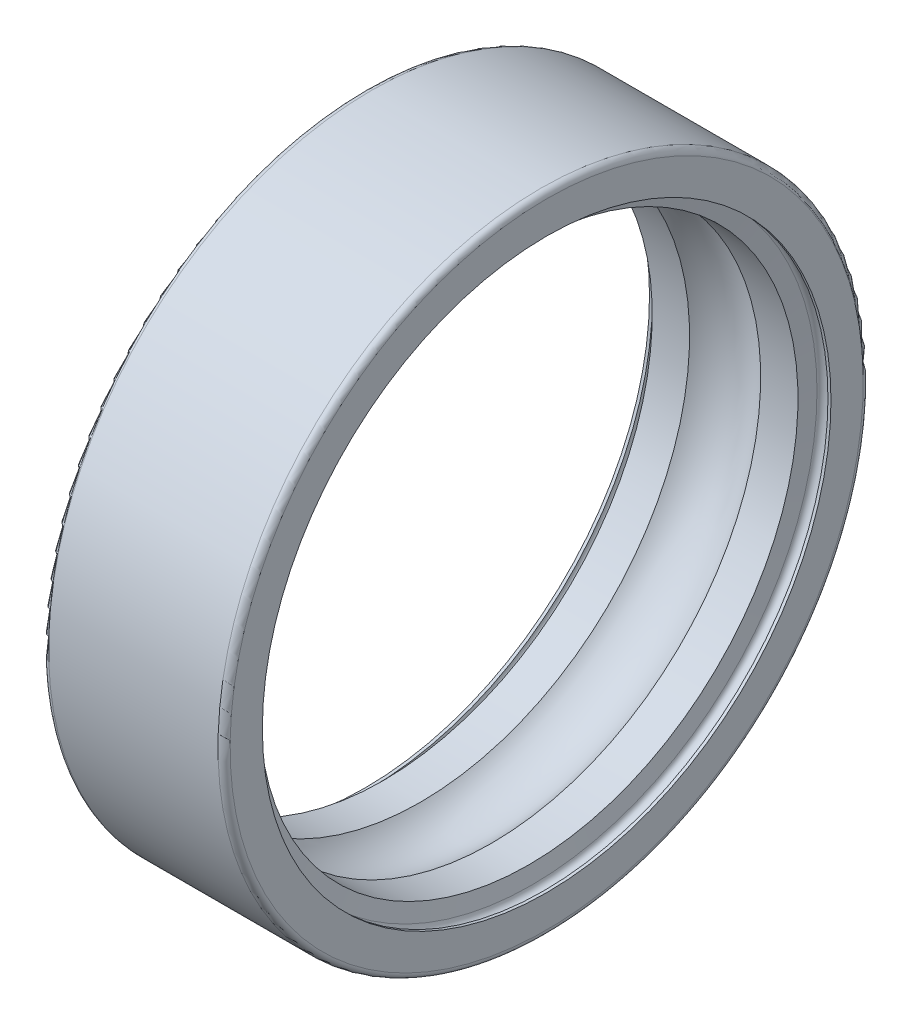
ISO-10303-21;
HEADER;
FILE_DESCRIPTION(('STEP AP214'),'2;1');
FILE_NAME('part.step','',(''),(''),'','','');
FILE_SCHEMA(('AUTOMOTIVE_DESIGN { 1 0 10303 214 1 1 1 1 }'));
ENDSEC;
DATA;
#1=APPLICATION_CONTEXT('core data for automotive mechanical design processes');
#2=APPLICATION_PROTOCOL_DEFINITION('international standard','automotive_design',2000,#1);
#3=PRODUCT_CONTEXT('',#1,'mechanical');
#4=PRODUCT('Part','Part','',(#3));
#5=PRODUCT_RELATED_PRODUCT_CATEGORY('part','',(#4));
#6=PRODUCT_DEFINITION_FORMATION('','',#4);
#7=PRODUCT_DEFINITION_CONTEXT('part definition',#1,'design');
#8=PRODUCT_DEFINITION('design','',#6,#7);
#9=PRODUCT_DEFINITION_SHAPE('','',#8);
#10=(LENGTH_UNIT() NAMED_UNIT(*) SI_UNIT(.MILLI.,.METRE.));
#11=(NAMED_UNIT(*) PLANE_ANGLE_UNIT() SI_UNIT($,.RADIAN.));
#12=(NAMED_UNIT(*) SI_UNIT($,.STERADIAN.) SOLID_ANGLE_UNIT());
#13=UNCERTAINTY_MEASURE_WITH_UNIT(LENGTH_MEASURE(1.E-05),#10,'distance_accuracy_value','');
#14=(GEOMETRIC_REPRESENTATION_CONTEXT(3) GLOBAL_UNCERTAINTY_ASSIGNED_CONTEXT((#13)) GLOBAL_UNIT_ASSIGNED_CONTEXT((#10,
#11,#12)) REPRESENTATION_CONTEXT('',''));
#15=CARTESIAN_POINT('',(0.,0.,0.));
#16=DIRECTION('',(0.,0.,1.));
#17=DIRECTION('',(1.,0.,0.));
#18=AXIS2_PLACEMENT_3D('',#15,#16,#17);
#19=CARTESIAN_POINT('',(8.55,0.,0.));
#20=DIRECTION('',(1.,0.,0.));
#21=DIRECTION('',(0.,0.,-1.));
#22=AXIS2_PLACEMENT_3D('',#19,#20,#21);
#23=TOROIDAL_SURFACE('',#22,14.1,0.3);
#24=CARTESIAN_POINT('',(8.85,0.,0.));
#25=DIRECTION('',(1.,0.,0.));
#26=DIRECTION('',(0.,1.,0.));
#27=AXIS2_PLACEMENT_3D('',#24,#25,#26);
#28=CIRCLE('',#27,14.1);
#29=CARTESIAN_POINT('',(8.85,14.1,0.));
#30=VERTEX_POINT('',#29);
#31=EDGE_CURVE('E11',#30,#30,#28,.T.);
#32=ORIENTED_EDGE('',*,*,#31,.T.);
#33=EDGE_LOOP('',(#32));
#34=FACE_BOUND('',#33,.T.);
#35=CARTESIAN_POINT('',(8.25455767409634,0.,0.));
#36=DIRECTION('',(1.,0.,0.));
#37=DIRECTION('',(0.,1.,0.));
#38=AXIS2_PLACEMENT_3D('',#35,#36,#37);
#39=CIRCLE('',#38,14.1520944533001);
#40=CARTESIAN_POINT('',(8.25455767409634,14.1520944533001,0.));
#41=VERTEX_POINT('',#40);
#42=EDGE_CURVE('E78',#41,#41,#39,.T.);
#43=ORIENTED_EDGE('',*,*,#42,.F.);
#44=EDGE_LOOP('',(#43));
#45=FACE_BOUND('',#44,.T.);
#46=ADVANCED_FACE('F17',(#34,#45),#23,.F.);
#47=CARTESIAN_POINT('',(8.925,0.,0.));
#48=DIRECTION('',(-1.,0.,0.));
#49=DIRECTION('',(0.,1.,0.));
#50=AXIS2_PLACEMENT_3D('',#47,#48,#49);
#51=CYLINDRICAL_SURFACE('',#50,14.1);
#52=CARTESIAN_POINT('',(9.,0.,0.));
#53=DIRECTION('',(1.,0.,0.));
#54=DIRECTION('',(0.,1.,0.));
#55=AXIS2_PLACEMENT_3D('',#52,#53,#54);
#56=CIRCLE('',#55,14.1);
#57=CARTESIAN_POINT('',(9.,14.1,0.));
#58=VERTEX_POINT('',#57);
#59=EDGE_CURVE('E27',#58,#58,#56,.T.);
#60=ORIENTED_EDGE('',*,*,#59,.T.);
#61=EDGE_LOOP('',(#60));
#62=FACE_BOUND('',#61,.T.);
#63=ORIENTED_EDGE('',*,*,#31,.F.);
#64=EDGE_LOOP('',(#63));
#65=FACE_BOUND('',#64,.T.);
#66=ADVANCED_FACE('F117',(#62,#65),#51,.F.);
#67=CARTESIAN_POINT('',(9.,14.9,0.));
#68=DIRECTION('',(1.,0.,0.));
#69=DIRECTION('',(0.,1.,0.));
#70=AXIS2_PLACEMENT_3D('',#67,#68,#69);
#71=PLANE('',#70);
#72=CARTESIAN_POINT('',(9.,0.,0.));
#73=DIRECTION('',(1.,0.,0.));
#74=DIRECTION('',(0.,1.,0.));
#75=AXIS2_PLACEMENT_3D('',#72,#73,#74);
#76=CIRCLE('',#75,15.7);
#77=CARTESIAN_POINT('',(9.,15.7,0.));
#78=VERTEX_POINT('',#77);
#79=EDGE_CURVE('E91',#78,#78,#76,.T.);
#80=ORIENTED_EDGE('',*,*,#79,.T.);
#81=EDGE_LOOP('',(#80));
#82=FACE_BOUND('',#81,.T.);
#83=ORIENTED_EDGE('',*,*,#59,.F.);
#84=EDGE_LOOP('',(#83));
#85=FACE_BOUND('',#84,.T.);
#86=ADVANCED_FACE('F122',(#82,#85),#71,.T.);
#87=CARTESIAN_POINT('',(8.7,0.,0.));
#88=DIRECTION('',(1.,0.,0.));
#89=DIRECTION('',(0.,0.,-1.));
#90=AXIS2_PLACEMENT_3D('',#87,#88,#89);
#91=TOROIDAL_SURFACE('',#90,15.7,0.3);
#92=CARTESIAN_POINT('',(8.7,0.,0.));
#93=DIRECTION('',(1.,0.,0.));
#94=DIRECTION('',(0.,1.,0.));
#95=AXIS2_PLACEMENT_3D('',#92,#93,#94);
#96=CIRCLE('',#95,16.);
#97=CARTESIAN_POINT('',(8.7,16.,0.));
#98=VERTEX_POINT('',#97);
#99=EDGE_CURVE('E88',#98,#98,#96,.T.);
#100=ORIENTED_EDGE('',*,*,#99,.T.);
#101=EDGE_LOOP('',(#100));
#102=FACE_BOUND('',#101,.T.);
#103=ORIENTED_EDGE('',*,*,#79,.F.);
#104=EDGE_LOOP('',(#103));
#105=FACE_BOUND('',#104,.T.);
#106=ADVANCED_FACE('F128',(#102,#105),#91,.T.);
#107=CARTESIAN_POINT('',(4.5,0.,0.));
#108=DIRECTION('',(-1.,0.,0.));
#109=DIRECTION('',(0.,1.,0.));
#110=AXIS2_PLACEMENT_3D('',#107,#108,#109);
#111=CYLINDRICAL_SURFACE('',#110,16.);
#112=CARTESIAN_POINT('',(0.3,0.,0.));
#113=DIRECTION('',(1.,0.,0.));
#114=DIRECTION('',(0.,1.,0.));
#115=AXIS2_PLACEMENT_3D('',#112,#113,#114);
#116=CIRCLE('',#115,16.);
#117=CARTESIAN_POINT('',(0.3,16.,0.));
#118=VERTEX_POINT('',#117);
#119=EDGE_CURVE('E87',#118,#118,#116,.T.);
#120=ORIENTED_EDGE('',*,*,#119,.T.);
#121=EDGE_LOOP('',(#120));
#122=FACE_BOUND('',#121,.T.);
#123=ORIENTED_EDGE('',*,*,#99,.F.);
#124=EDGE_LOOP('',(#123));
#125=FACE_BOUND('',#124,.T.);
#126=ADVANCED_FACE('F114',(#122,#125),#111,.T.);
#127=CARTESIAN_POINT('',(0.3,0.,0.));
#128=DIRECTION('',(1.,0.,0.));
#129=DIRECTION('',(0.,0.,-1.));
#130=AXIS2_PLACEMENT_3D('',#127,#128,#129);
#131=TOROIDAL_SURFACE('',#130,15.7,0.3);
#132=CARTESIAN_POINT('',(0.,0.,0.));
#133=DIRECTION('',(1.,0.,0.));
#134=DIRECTION('',(0.,1.,0.));
#135=AXIS2_PLACEMENT_3D('',#132,#133,#134);
#136=CIRCLE('',#135,15.7);
#137=CARTESIAN_POINT('',(0.,15.7,0.));
#138=VERTEX_POINT('',#137);
#139=EDGE_CURVE('E89',#138,#138,#136,.T.);
#140=ORIENTED_EDGE('',*,*,#139,.T.);
#141=EDGE_LOOP('',(#140));
#142=FACE_BOUND('',#141,.T.);
#143=ORIENTED_EDGE('',*,*,#119,.F.);
#144=EDGE_LOOP('',(#143));
#145=FACE_BOUND('',#144,.T.);
#146=ADVANCED_FACE('F101',(#142,#145),#131,.T.);
#147=CARTESIAN_POINT('',(0.,14.9,0.));
#148=DIRECTION('',(-1.,0.,0.));
#149=DIRECTION('',(0.,-1.,0.));
#150=AXIS2_PLACEMENT_3D('',#147,#148,#149);
#151=PLANE('',#150);
#152=CARTESIAN_POINT('',(0.,0.,0.));
#153=DIRECTION('',(1.,0.,0.));
#154=DIRECTION('',(0.,1.,0.));
#155=AXIS2_PLACEMENT_3D('',#152,#153,#154);
#156=CIRCLE('',#155,14.1);
#157=CARTESIAN_POINT('',(0.,14.1,0.));
#158=VERTEX_POINT('',#157);
#159=EDGE_CURVE('E85',#158,#158,#156,.T.);
#160=ORIENTED_EDGE('',*,*,#159,.T.);
#161=EDGE_LOOP('',(#160));
#162=FACE_BOUND('',#161,.T.);
#163=ORIENTED_EDGE('',*,*,#139,.F.);
#164=EDGE_LOOP('',(#163));
#165=FACE_BOUND('',#164,.T.);
#166=ADVANCED_FACE('F19',(#162,#165),#151,.T.);
#167=CARTESIAN_POINT('',(0.075,0.,0.));
#168=DIRECTION('',(-1.,0.,0.));
#169=DIRECTION('',(0.,1.,0.));
#170=AXIS2_PLACEMENT_3D('',#167,#168,#169);
#171=CYLINDRICAL_SURFACE('',#170,14.1);
#172=CARTESIAN_POINT('',(0.15,0.,0.));
#173=DIRECTION('',(1.,0.,0.));
#174=DIRECTION('',(0.,1.,0.));
#175=AXIS2_PLACEMENT_3D('',#172,#173,#174);
#176=CIRCLE('',#175,14.1);
#177=CARTESIAN_POINT('',(0.15,14.1,0.));
#178=VERTEX_POINT('',#177);
#179=EDGE_CURVE('E83',#178,#178,#176,.T.);
#180=ORIENTED_EDGE('',*,*,#179,.T.);
#181=EDGE_LOOP('',(#180));
#182=FACE_BOUND('',#181,.T.);
#183=ORIENTED_EDGE('',*,*,#159,.F.);
#184=EDGE_LOOP('',(#183));
#185=FACE_BOUND('',#184,.T.);
#186=ADVANCED_FACE('F105',(#182,#185),#171,.F.);
#187=CARTESIAN_POINT('',(0.45,0.,0.));
#188=DIRECTION('',(1.,0.,0.));
#189=DIRECTION('',(0.,0.,-1.));
#190=AXIS2_PLACEMENT_3D('',#187,#188,#189);
#191=TOROIDAL_SURFACE('',#190,14.1,0.3);
#192=CARTESIAN_POINT('',(0.745442325903662,0.,0.));
#193=DIRECTION('',(1.,0.,0.));
#194=DIRECTION('',(0.,1.,0.));
#195=AXIS2_PLACEMENT_3D('',#192,#193,#194);
#196=CIRCLE('',#195,14.1520944533001);
#197=CARTESIAN_POINT('',(0.745442325903662,14.1520944533001,0.));
#198=VERTEX_POINT('',#197);
#199=EDGE_CURVE('E86',#198,#198,#196,.T.);
#200=ORIENTED_EDGE('',*,*,#199,.T.);
#201=EDGE_LOOP('',(#200));
#202=FACE_BOUND('',#201,.T.);
#203=ORIENTED_EDGE('',*,*,#179,.F.);
#204=EDGE_LOOP('',(#203));
#205=FACE_BOUND('',#204,.T.);
#206=ADVANCED_FACE('F112',(#202,#205),#191,.F.);
#207=CARTESIAN_POINT('',(0.816157772500366,0.,0.));
#208=DIRECTION('',(-1.,0.,0.));
#209=DIRECTION('',(0.,1.,0.));
#210=AXIS2_PLACEMENT_3D('',#207,#208,#209);
#211=CONICAL_SURFACE('',#210,13.75104722665,1.39626340159546);
#212=CARTESIAN_POINT('',(0.886873219097073,0.,0.));
#213=DIRECTION('',(1.,0.,0.));
#214=DIRECTION('',(0.,1.,0.));
#215=AXIS2_PLACEMENT_3D('',#212,#213,#214);
#216=CIRCLE('',#215,13.35);
#217=CARTESIAN_POINT('',(0.886873219097072,13.35,0.));
#218=VERTEX_POINT('',#217);
#219=EDGE_CURVE('E94',#218,#218,#216,.T.);
#220=ORIENTED_EDGE('',*,*,#219,.T.);
#221=EDGE_LOOP('',(#220));
#222=FACE_BOUND('',#221,.T.);
#223=ORIENTED_EDGE('',*,*,#199,.F.);
#224=EDGE_LOOP('',(#223));
#225=FACE_BOUND('',#224,.T.);
#226=ADVANCED_FACE('F137',(#222,#225),#211,.F.);
#227=CARTESIAN_POINT('',(1.81179595145704,0.,0.));
#228=DIRECTION('',(-1.,0.,0.));
#229=DIRECTION('',(0.,1.,0.));
#230=AXIS2_PLACEMENT_3D('',#227,#228,#229);
#231=CYLINDRICAL_SURFACE('',#230,13.35);
#232=CARTESIAN_POINT('',(2.73671868381702,0.,0.));
#233=DIRECTION('',(1.,0.,0.));
#234=DIRECTION('',(0.,1.,0.));
#235=AXIS2_PLACEMENT_3D('',#232,#233,#234);
#236=CIRCLE('',#235,13.35);
#237=CARTESIAN_POINT('',(2.73671868381702,13.35,0.));
#238=VERTEX_POINT('',#237);
#239=EDGE_CURVE('E53',#238,#238,#236,.T.);
#240=ORIENTED_EDGE('',*,*,#239,.T.);
#241=EDGE_LOOP('',(#240));
#242=FACE_BOUND('',#241,.T.);
#243=ORIENTED_EDGE('',*,*,#219,.F.);
#244=EDGE_LOOP('',(#243));
#245=FACE_BOUND('',#244,.T.);
#246=ADVANCED_FACE('F134',(#242,#245),#231,.F.);
#247=CARTESIAN_POINT('',(4.5,0.,0.));
#248=DIRECTION('',(1.,0.,0.));
#249=DIRECTION('',(0.,0.,-1.));
#250=AXIS2_PLACEMENT_3D('',#247,#248,#249);
#251=TOROIDAL_SURFACE('',#250,11.75,2.381);
#252=CARTESIAN_POINT('',(6.26328131618298,0.,0.));
#253=DIRECTION('',(1.,0.,0.));
#254=DIRECTION('',(0.,1.,0.));
#255=AXIS2_PLACEMENT_3D('',#252,#253,#254);
#256=CIRCLE('',#255,13.35);
#257=CARTESIAN_POINT('',(6.26328131618298,13.35,0.));
#258=VERTEX_POINT('',#257);
#259=EDGE_CURVE('E21',#258,#258,#256,.T.);
#260=ORIENTED_EDGE('',*,*,#259,.T.);
#261=EDGE_LOOP('',(#260));
#262=FACE_BOUND('',#261,.T.);
#263=ORIENTED_EDGE('',*,*,#239,.F.);
#264=EDGE_LOOP('',(#263));
#265=FACE_BOUND('',#264,.T.);
#266=ADVANCED_FACE('F136',(#262,#265),#251,.F.);
#267=CARTESIAN_POINT('',(7.18820404854295,0.,0.));
#268=DIRECTION('',(-1.,0.,0.));
#269=DIRECTION('',(0.,1.,0.));
#270=AXIS2_PLACEMENT_3D('',#267,#268,#269);
#271=CYLINDRICAL_SURFACE('',#270,13.35);
#272=CARTESIAN_POINT('',(8.11312678090293,0.,0.));
#273=DIRECTION('',(1.,0.,0.));
#274=DIRECTION('',(0.,1.,0.));
#275=AXIS2_PLACEMENT_3D('',#272,#273,#274);
#276=CIRCLE('',#275,13.35);
#277=CARTESIAN_POINT('',(8.11312678090293,13.35,0.));
#278=VERTEX_POINT('',#277);
#279=EDGE_CURVE('E74',#278,#278,#276,.T.);
#280=ORIENTED_EDGE('',*,*,#279,.T.);
#281=EDGE_LOOP('',(#280));
#282=FACE_BOUND('',#281,.T.);
#283=ORIENTED_EDGE('',*,*,#259,.F.);
#284=EDGE_LOOP('',(#283));
#285=FACE_BOUND('',#284,.T.);
#286=ADVANCED_FACE('F75',(#282,#285),#271,.F.);
#287=CARTESIAN_POINT('',(8.18384222749963,0.,0.));
#288=DIRECTION('',(1.,0.,0.));
#289=DIRECTION('',(0.,1.,0.));
#290=AXIS2_PLACEMENT_3D('',#287,#288,#289);
#291=CONICAL_SURFACE('',#290,13.75104722665,1.39626340159546);
#292=ORIENTED_EDGE('',*,*,#42,.T.);
#293=EDGE_LOOP('',(#292));
#294=FACE_BOUND('',#293,.T.);
#295=ORIENTED_EDGE('',*,*,#279,.F.);
#296=EDGE_LOOP('',(#295));
#297=FACE_BOUND('',#296,.T.);
#298=ADVANCED_FACE('F130',(#294,#297),#291,.F.);
#299=CLOSED_SHELL('',(#46,#66,#86,#106,#126,#146,#166,#186,#206,#226,#246,#266,#286,#298));
#300=MANIFOLD_SOLID_BREP('B1',#299);
#301=ADVANCED_BREP_SHAPE_REPRESENTATION('',(#18,#300),#14);
#302=SHAPE_DEFINITION_REPRESENTATION(#9,#301);
ENDSEC;
END-ISO-10303-21;
